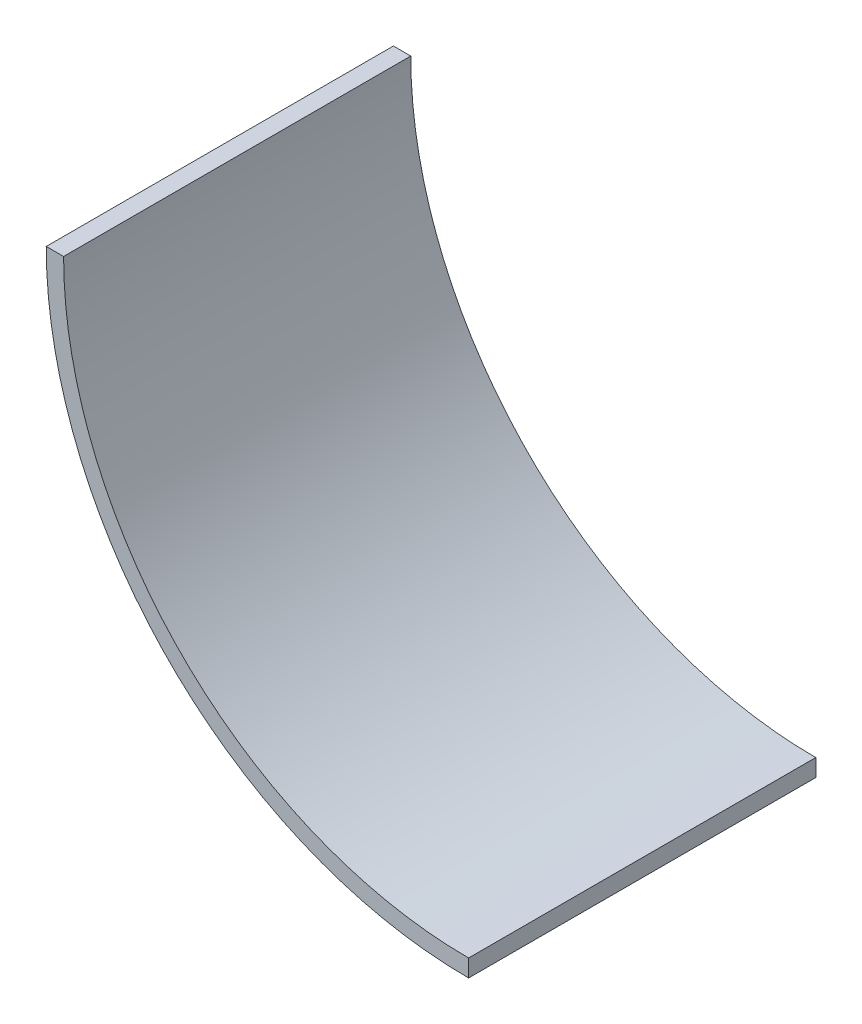
ISO-10303-21;
HEADER;
FILE_DESCRIPTION(('STEP AP214'),'2;1');
FILE_NAME('part.step','',(''),(''),'','','');
FILE_SCHEMA(('AUTOMOTIVE_DESIGN { 1 0 10303 214 1 1 1 1 }'));
ENDSEC;
DATA;
#1=APPLICATION_CONTEXT('core data for automotive mechanical design processes');
#2=APPLICATION_PROTOCOL_DEFINITION('international standard','automotive_design',2000,#1);
#3=PRODUCT_CONTEXT('',#1,'mechanical');
#4=PRODUCT('Part','Part','',(#3));
#5=PRODUCT_RELATED_PRODUCT_CATEGORY('part','',(#4));
#6=PRODUCT_DEFINITION_FORMATION('','',#4);
#7=PRODUCT_DEFINITION_CONTEXT('part definition',#1,'design');
#8=PRODUCT_DEFINITION('design','',#6,#7);
#9=PRODUCT_DEFINITION_SHAPE('','',#8);
#10=(LENGTH_UNIT() NAMED_UNIT(*) SI_UNIT(.MILLI.,.METRE.));
#11=(NAMED_UNIT(*) PLANE_ANGLE_UNIT() SI_UNIT($,.RADIAN.));
#12=(NAMED_UNIT(*) SI_UNIT($,.STERADIAN.) SOLID_ANGLE_UNIT());
#13=UNCERTAINTY_MEASURE_WITH_UNIT(LENGTH_MEASURE(1.E-05),#10,'distance_accuracy_value','');
#14=(GEOMETRIC_REPRESENTATION_CONTEXT(3) GLOBAL_UNCERTAINTY_ASSIGNED_CONTEXT((#13)) GLOBAL_UNIT_ASSIGNED_CONTEXT((#10,
#11,#12)) REPRESENTATION_CONTEXT('',''));
#15=CARTESIAN_POINT('',(0.,0.,0.));
#16=DIRECTION('',(0.,0.,1.));
#17=DIRECTION('',(1.,0.,0.));
#18=AXIS2_PLACEMENT_3D('',#15,#16,#17);
#19=CARTESIAN_POINT('',(0.,0.,30.));
#20=DIRECTION('',(0.,0.,-1.));
#21=DIRECTION('',(-1.,0.,0.));
#22=AXIS2_PLACEMENT_3D('',#19,#20,#21);
#23=CYLINDRICAL_SURFACE('',#22,36.5);
#24=CARTESIAN_POINT('',(0.,0.,0.));
#25=DIRECTION('',(0.,0.,1.));
#26=DIRECTION('',(1.,0.,0.));
#27=AXIS2_PLACEMENT_3D('',#24,#25,#26);
#28=CIRCLE('',#27,36.5);
#29=CARTESIAN_POINT('',(-36.5,0.,0.));
#30=VERTEX_POINT('',#29);
#31=CARTESIAN_POINT('',(0.,-36.5,0.));
#32=VERTEX_POINT('',#31);
#33=EDGE_CURVE('E107',#30,#32,#28,.T.);
#34=ORIENTED_EDGE('',*,*,#33,.T.);
#35=DIRECTION('',(0.,0.,-1.));
#36=VECTOR('',#35,1.);
#37=CARTESIAN_POINT('',(0.,-36.5,30.));
#38=LINE('',#37,#36);
#39=CARTESIAN_POINT('',(0.,-36.5,30.));
#40=VERTEX_POINT('',#39);
#41=EDGE_CURVE('E11',#40,#32,#38,.T.);
#42=ORIENTED_EDGE('',*,*,#41,.F.);
#43=CARTESIAN_POINT('',(0.,0.,30.));
#44=DIRECTION('',(0.,0.,1.));
#45=DIRECTION('',(1.,0.,0.));
#46=AXIS2_PLACEMENT_3D('',#43,#44,#45);
#47=CIRCLE('',#46,36.5);
#48=CARTESIAN_POINT('',(-36.5,0.,30.));
#49=VERTEX_POINT('',#48);
#50=EDGE_CURVE('E80',#49,#40,#47,.T.);
#51=ORIENTED_EDGE('',*,*,#50,.F.);
#52=DIRECTION('',(0.,0.,-1.));
#53=VECTOR('',#52,1.);
#54=CARTESIAN_POINT('',(-36.5,0.,30.));
#55=LINE('',#54,#53);
#56=EDGE_CURVE('E56',#49,#30,#55,.T.);
#57=ORIENTED_EDGE('',*,*,#56,.T.);
#58=EDGE_LOOP('',(#34,#42,#51,#57));
#59=FACE_BOUND('',#58,.T.);
#60=ADVANCED_FACE('F39',(#59),#23,.T.);
#61=CARTESIAN_POINT('',(0.,-35.,30.));
#62=DIRECTION('',(1.,0.,0.));
#63=DIRECTION('',(0.,1.,0.));
#64=AXIS2_PLACEMENT_3D('',#61,#62,#63);
#65=PLANE('',#64);
#66=DIRECTION('',(0.,-1.,0.));
#67=VECTOR('',#66,1.);
#68=CARTESIAN_POINT('',(0.,-35.,0.));
#69=LINE('',#68,#67);
#70=CARTESIAN_POINT('',(0.,-35.,0.));
#71=VERTEX_POINT('',#70);
#72=EDGE_CURVE('E89',#71,#32,#69,.T.);
#73=ORIENTED_EDGE('',*,*,#72,.F.);
#74=DIRECTION('',(0.,0.,-1.));
#75=VECTOR('',#74,1.);
#76=CARTESIAN_POINT('',(0.,-35.,30.));
#77=LINE('',#76,#75);
#78=CARTESIAN_POINT('',(0.,-35.,30.));
#79=VERTEX_POINT('',#78);
#80=EDGE_CURVE('E48',#79,#71,#77,.T.);
#81=ORIENTED_EDGE('',*,*,#80,.F.);
#82=DIRECTION('',(0.,-1.,0.));
#83=VECTOR('',#82,1.);
#84=CARTESIAN_POINT('',(0.,-35.,30.));
#85=LINE('',#84,#83);
#86=EDGE_CURVE('E87',#79,#40,#85,.T.);
#87=ORIENTED_EDGE('',*,*,#86,.T.);
#88=ORIENTED_EDGE('',*,*,#41,.T.);
#89=EDGE_LOOP('',(#73,#81,#87,#88));
#90=FACE_BOUND('',#89,.T.);
#91=ADVANCED_FACE('F86',(#90),#65,.T.);
#92=CARTESIAN_POINT('',(0.,0.,30.));
#93=DIRECTION('',(0.,0.,-1.));
#94=DIRECTION('',(-1.,0.,0.));
#95=AXIS2_PLACEMENT_3D('',#92,#93,#94);
#96=CYLINDRICAL_SURFACE('',#95,35.);
#97=CARTESIAN_POINT('',(0.,0.,0.));
#98=DIRECTION('',(0.,0.,1.));
#99=DIRECTION('',(1.,0.,0.));
#100=AXIS2_PLACEMENT_3D('',#97,#98,#99);
#101=CIRCLE('',#100,35.);
#102=CARTESIAN_POINT('',(-35.,0.,0.));
#103=VERTEX_POINT('',#102);
#104=EDGE_CURVE('E112',#103,#71,#101,.T.);
#105=ORIENTED_EDGE('',*,*,#104,.F.);
#106=DIRECTION('',(0.,0.,-1.));
#107=VECTOR('',#106,1.);
#108=CARTESIAN_POINT('',(-35.,0.,30.));
#109=LINE('',#108,#107);
#110=CARTESIAN_POINT('',(-35.,0.,30.));
#111=VERTEX_POINT('',#110);
#112=EDGE_CURVE('E69',#111,#103,#109,.T.);
#113=ORIENTED_EDGE('',*,*,#112,.F.);
#114=CARTESIAN_POINT('',(0.,0.,30.));
#115=DIRECTION('',(0.,0.,1.));
#116=DIRECTION('',(1.,0.,0.));
#117=AXIS2_PLACEMENT_3D('',#114,#115,#116);
#118=CIRCLE('',#117,35.);
#119=EDGE_CURVE('E96',#111,#79,#118,.T.);
#120=ORIENTED_EDGE('',*,*,#119,.T.);
#121=ORIENTED_EDGE('',*,*,#80,.T.);
#122=EDGE_LOOP('',(#105,#113,#120,#121));
#123=FACE_BOUND('',#122,.T.);
#124=ADVANCED_FACE('F99',(#123),#96,.F.);
#125=CARTESIAN_POINT('',(-36.5,0.,30.));
#126=DIRECTION('',(0.,1.,0.));
#127=DIRECTION('',(-1.,0.,0.));
#128=AXIS2_PLACEMENT_3D('',#125,#126,#127);
#129=PLANE('',#128);
#130=DIRECTION('',(1.,0.,0.));
#131=VECTOR('',#130,1.);
#132=CARTESIAN_POINT('',(-36.5,0.,0.));
#133=LINE('',#132,#131);
#134=EDGE_CURVE('E115',#30,#103,#133,.T.);
#135=ORIENTED_EDGE('',*,*,#134,.F.);
#136=ORIENTED_EDGE('',*,*,#56,.F.);
#137=DIRECTION('',(1.,0.,0.));
#138=VECTOR('',#137,1.);
#139=CARTESIAN_POINT('',(-36.5,0.,30.));
#140=LINE('',#139,#138);
#141=EDGE_CURVE('E101',#49,#111,#140,.T.);
#142=ORIENTED_EDGE('',*,*,#141,.T.);
#143=ORIENTED_EDGE('',*,*,#112,.T.);
#144=EDGE_LOOP('',(#135,#136,#142,#143));
#145=FACE_BOUND('',#144,.T.);
#146=ADVANCED_FACE('F125',(#145),#129,.T.);
#147=CARTESIAN_POINT('',(0.,0.,30.));
#148=DIRECTION('',(0.,0.,1.));
#149=DIRECTION('',(1.,0.,0.));
#150=AXIS2_PLACEMENT_3D('',#147,#148,#149);
#151=PLANE('',#150);
#152=ORIENTED_EDGE('',*,*,#50,.T.);
#153=ORIENTED_EDGE('',*,*,#86,.F.);
#154=ORIENTED_EDGE('',*,*,#119,.F.);
#155=ORIENTED_EDGE('',*,*,#141,.F.);
#156=EDGE_LOOP('',(#152,#153,#154,#155));
#157=FACE_BOUND('',#156,.T.);
#158=ADVANCED_FACE('F95',(#157),#151,.T.);
#159=CARTESIAN_POINT('',(0.,0.,0.));
#160=DIRECTION('',(0.,0.,1.));
#161=DIRECTION('',(1.,0.,0.));
#162=AXIS2_PLACEMENT_3D('',#159,#160,#161);
#163=PLANE('',#162);
#164=ORIENTED_EDGE('',*,*,#33,.F.);
#165=ORIENTED_EDGE('',*,*,#134,.T.);
#166=ORIENTED_EDGE('',*,*,#104,.T.);
#167=ORIENTED_EDGE('',*,*,#72,.T.);
#168=EDGE_LOOP('',(#164,#165,#166,#167));
#169=FACE_BOUND('',#168,.T.);
#170=ADVANCED_FACE('F124',(#169),#163,.F.);
#171=CLOSED_SHELL('',(#60,#91,#124,#146,#158,#170));
#172=MANIFOLD_SOLID_BREP('B2',#171);
#173=ADVANCED_BREP_SHAPE_REPRESENTATION('',(#18,#172),#14);
#174=SHAPE_DEFINITION_REPRESENTATION(#9,#173);
ENDSEC;
END-ISO-10303-21;
